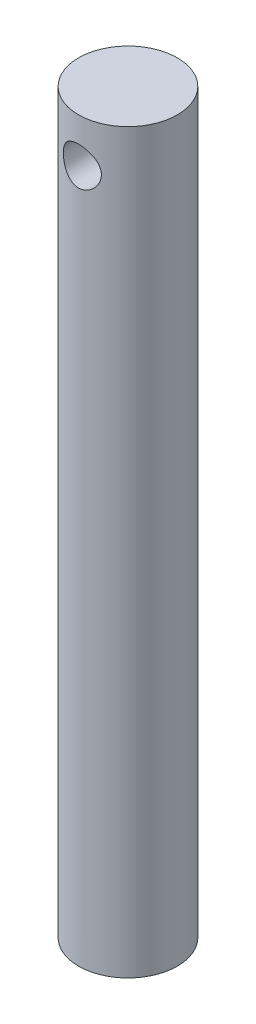
ISO-10303-21;
HEADER;
FILE_DESCRIPTION(('STEP AP214'),'2;1');
FILE_NAME('part.step','',(''),(''),'','','');
FILE_SCHEMA(('AUTOMOTIVE_DESIGN { 1 0 10303 214 1 1 1 1 }'));
ENDSEC;
DATA;
#1=APPLICATION_CONTEXT('core data for automotive mechanical design processes');
#2=APPLICATION_PROTOCOL_DEFINITION('international standard','automotive_design',2000,#1);
#3=PRODUCT_CONTEXT('',#1,'mechanical');
#4=PRODUCT('Part','Part','',(#3));
#5=PRODUCT_RELATED_PRODUCT_CATEGORY('part','',(#4));
#6=PRODUCT_DEFINITION_FORMATION('','',#4);
#7=PRODUCT_DEFINITION_CONTEXT('part definition',#1,'design');
#8=PRODUCT_DEFINITION('design','',#6,#7);
#9=PRODUCT_DEFINITION_SHAPE('','',#8);
#10=(LENGTH_UNIT() NAMED_UNIT(*) SI_UNIT(.MILLI.,.METRE.));
#11=(NAMED_UNIT(*) PLANE_ANGLE_UNIT() SI_UNIT($,.RADIAN.));
#12=(NAMED_UNIT(*) SI_UNIT($,.STERADIAN.) SOLID_ANGLE_UNIT());
#13=UNCERTAINTY_MEASURE_WITH_UNIT(LENGTH_MEASURE(1.E-05),#10,'distance_accuracy_value','');
#14=(GEOMETRIC_REPRESENTATION_CONTEXT(3) GLOBAL_UNCERTAINTY_ASSIGNED_CONTEXT((#13)) GLOBAL_UNIT_ASSIGNED_CONTEXT((#10,
#11,#12)) REPRESENTATION_CONTEXT('',''));
#15=CARTESIAN_POINT('',(0.,0.,0.));
#16=DIRECTION('',(0.,0.,1.));
#17=DIRECTION('',(1.,0.,0.));
#18=AXIS2_PLACEMENT_3D('',#15,#16,#17);
#19=CARTESIAN_POINT('',(0.,127.,0.));
#20=DIRECTION('',(0.,-1.,0.));
#21=DIRECTION('',(0.,0.,-1.));
#22=AXIS2_PLACEMENT_3D('',#19,#20,#21);
#23=CYLINDRICAL_SURFACE('',#22,9.906);
#24=CARTESIAN_POINT('',(-3.81,138.938,9.144));
#25=CARTESIAN_POINT('',(-3.81000064407979,138.835367761557,9.14399940626881));
#26=CARTESIAN_POINT('',(-3.80584949466351,138.732743870049,9.14573263028228));
#27=CARTESIAN_POINT('',(-3.78929119284377,138.528245611501,9.15260559865723));
#28=CARTESIAN_POINT('',(-3.77688145220304,138.426371489562,9.15774641095272));
#29=CARTESIAN_POINT('',(-3.74393962490596,138.22421007908,9.17126322748425));
#30=CARTESIAN_POINT('',(-3.72341135670093,138.123922067558,9.17963771075854));
#31=CARTESIAN_POINT('',(-3.67444672922316,137.925579710643,9.1993459318876));
#32=CARTESIAN_POINT('',(-3.64600722875716,137.827526269264,9.210680845086));
#33=CARTESIAN_POINT('',(-3.54937685298785,137.538293402116,9.24854539144749));
#34=CARTESIAN_POINT('',(-3.46975226991935,137.351305122067,9.27898805963824));
#35=CARTESIAN_POINT('',(-3.2825953359449,136.993377578225,9.34683127229454));
#36=CARTESIAN_POINT('',(-3.17505415950617,136.822443413082,9.38423401605287));
#37=CARTESIAN_POINT('',(-2.9290577708463,136.49238282444,9.46398061417543));
#38=CARTESIAN_POINT('',(-2.78937450425499,136.334206028794,9.50647493369805));
#39=CARTESIAN_POINT('',(-2.48566837123645,136.042855648947,9.59036424595744));
#40=CARTESIAN_POINT('',(-2.32163997465159,135.909687761297,9.63175898639211));
#41=CARTESIAN_POINT('',(-1.96661228086564,135.667475176788,9.71058508592759));
#42=CARTESIAN_POINT('',(-1.77485371515296,135.559473496429,9.74781970452447));
#43=CARTESIAN_POINT('',(-1.37420271446898,135.377661781081,9.81231290433514));
#44=CARTESIAN_POINT('',(-1.16531658852297,135.303839222045,9.83957513889883));
#45=CARTESIAN_POINT('',(-0.746345393346816,135.195844056231,9.87998335779282));
#46=CARTESIAN_POINT('',(-0.536740129616208,135.160031982889,9.89371103140016));
#47=CARTESIAN_POINT('',(-0.114075261824232,135.123811580983,9.90759658617764));
#48=CARTESIAN_POINT('',(0.0989831355955358,135.123391141241,9.90775910940382));
#49=CARTESIAN_POINT('',(0.510717937437508,135.157032339318,9.89485997669889));
#50=CARTESIAN_POINT('',(0.709566088010392,135.18930201241,9.88248555149261));
#51=CARTESIAN_POINT('',(1.09877395484567,135.284380357875,9.84681373399076));
#52=CARTESIAN_POINT('',(1.28913306588263,135.347191203893,9.82351556424673));
#53=CARTESIAN_POINT('',(1.65930924013136,135.502351858105,9.76786112314378));
#54=CARTESIAN_POINT('',(1.83892884044366,135.595124647285,9.735376027404));
#55=CARTESIAN_POINT('',(2.18050433069836,135.807193478922,9.66461111215741));
#56=CARTESIAN_POINT('',(2.34245434320434,135.926498306882,9.62632937456256));
#57=CARTESIAN_POINT('',(2.6546141636287,136.196775727086,9.54512711153657));
#58=CARTESIAN_POINT('',(2.80349766677959,136.349240202233,9.50206607612672));
#59=CARTESIAN_POINT('',(3.07409976914635,136.677198128024,9.41800771900413));
#60=CARTESIAN_POINT('',(3.19581079788691,136.85269797494,9.37701097487769));
#61=CARTESIAN_POINT('',(3.41133193648662,137.227239500013,9.30081059772249));
#62=CARTESIAN_POINT('',(3.50438873364169,137.426751143538,9.26577274018051));
#63=CARTESIAN_POINT('',(3.65507214474186,137.840318039828,9.20738248122136));
#64=CARTESIAN_POINT('',(3.71271971060063,138.054364608731,9.18402317104371));
#65=CARTESIAN_POINT('',(3.78785230231926,138.477767574732,9.15328218541058));
#66=CARTESIAN_POINT('',(3.80745520129422,138.68668648539,9.14505937476269));
#67=CARTESIAN_POINT('',(3.81207771836109,139.104944675398,9.14313523480919));
#68=CARTESIAN_POINT('',(3.79710664273498,139.314283826476,9.14942999780548));
#69=CARTESIAN_POINT('',(3.73492969483969,139.716245247047,9.1749740058038));
#70=CARTESIAN_POINT('',(3.68940556027745,139.909175747685,9.19354667342028));
#71=CARTESIAN_POINT('',(3.56955542769551,140.284557063414,9.24073740296942));
#72=CARTESIAN_POINT('',(3.49522334435248,140.467005654976,9.26935758719549));
#73=CARTESIAN_POINT('',(3.31663888856321,140.824106517288,9.33477870200858));
#74=CARTESIAN_POINT('',(3.21133968577424,140.998183599877,9.37185342294639));
#75=CARTESIAN_POINT('',(2.97490700981402,141.326945735599,9.4495624591012));
#76=CARTESIAN_POINT('',(2.8437636654063,141.481623341996,9.49019813112897));
#77=CARTESIAN_POINT('',(2.54893041522458,141.778003070045,9.57375445727994));
#78=CARTESIAN_POINT('',(2.38364407893408,141.918131286564,9.61664483286183));
#79=CARTESIAN_POINT('',(2.03085929944928,142.16887184677,9.69727511936323));
#80=CARTESIAN_POINT('',(1.84336049333767,142.279483708109,9.73501494610908));
#81=CARTESIAN_POINT('',(1.45131942169701,142.467432143206,9.80111641873104));
#82=CARTESIAN_POINT('',(1.24681828496458,142.54484637833,9.82949991606386));
#83=CARTESIAN_POINT('',(0.826347495284124,142.663710045121,9.87373148779787));
#84=CARTESIAN_POINT('',(0.610383605247227,142.705177370744,9.88958579873585));
#85=CARTESIAN_POINT('',(0.187306801994696,142.748966599566,9.90635333328099));
#86=CARTESIAN_POINT('',(-0.0195433025637882,142.753520351434,9.90811831216707));
#87=CARTESIAN_POINT('',(-0.430943143853496,142.729151849029,9.89875943186073));
#88=CARTESIAN_POINT('',(-0.635493179334599,142.700233994214,9.88763726653536));
#89=CARTESIAN_POINT('',(-1.03091524998151,142.611323247502,9.85415730172312));
#90=CARTESIAN_POINT('',(-1.22200670984564,142.552181193136,9.8321076106909));
#91=CARTESIAN_POINT('',(-1.59155178379963,142.40536444401,9.77909410209705));
#92=CARTESIAN_POINT('',(-1.77000299715905,142.31768434669,9.74812859680339));
#93=CARTESIAN_POINT('',(-2.11760943784215,142.112012506323,9.67870518515733));
#94=CARTESIAN_POINT('',(-2.28603587580459,141.992880309749,9.63998253613216));
#95=CARTESIAN_POINT('',(-2.60118581085774,141.72944025956,9.55976767633285));
#96=CARTESIAN_POINT('',(-2.74790137698855,141.585123247705,9.51827446146684));
#97=CARTESIAN_POINT('',(-3.02395872855298,141.265830579638,9.43432533411643));
#98=CARTESIAN_POINT('',(-3.15186128444348,141.08958796698,9.39194630964859));
#99=CARTESIAN_POINT('',(-3.37636605799997,140.716634384034,9.31360345072929));
#100=CARTESIAN_POINT('',(-3.47296180622188,140.519919194241,9.27764094291817));
#101=CARTESIAN_POINT('',(-3.59440689020919,140.206875300182,9.23098564767509));
#102=CARTESIAN_POINT('',(-3.63171131729941,140.095817834503,9.21632772326485));
#103=CARTESIAN_POINT('',(-3.69601474500478,139.870356985496,9.1907300197407));
#104=CARTESIAN_POINT('',(-3.72301848526011,139.755955167153,9.17978853084318));
#105=CARTESIAN_POINT('',(-3.7663630913293,139.524880622978,9.16208998800678));
#106=CARTESIAN_POINT('',(-3.78270805513767,139.408208787691,9.15533132594167));
#107=CARTESIAN_POINT('',(-3.80452532812323,139.173687514795,9.14628700667753));
#108=CARTESIAN_POINT('',(-3.8099992604932,139.055838255633,9.14400068169854));
#109=CARTESIAN_POINT('',(-3.81,138.938,9.144));
#110=B_SPLINE_CURVE_WITH_KNOTS('',3,(#24,#25,#26,#27,#28,#29,#30,#31,#32,#33,#34,#35,#36,#37,
#38,#39,#40,#41,#42,#43,#44,#45,#46,#47,#48,#49,#50,#51,#52,#53,#54,#55,#56,#57,#58,#59,#60,#61,
#62,#63,#64,#65,#66,#67,#68,#69,#70,#71,#72,#73,#74,#75,#76,#77,#78,#79,#80,#81,#82,#83,#84,#85,
#86,#87,#88,#89,#90,#91,#92,#93,#94,#95,#96,#97,#98,#99,#100,#101,#102,#103,#104,#105,#106,#107,
#108,#109),.UNSPECIFIED.,.T.,.F.,(4,2,2,2,2,2,2,2,2,2,2,2,2,2,2,2,2,2,2,2,2,2,2,2,2,2,2,2,2,2,2,
2,2,2,2,2,2,2,2,2,2,2,4),(0.,0.307783699913211,0.615663904497332,0.923399473237848,
1.23125740471694,1.84475689700249,2.4584505773025,3.1013622734596,3.74442023542112,
4.41066635064775,5.07666814378749,5.71260479854275,6.34832383199484,6.95098485615205,
7.55368877851336,8.16530319158036,8.77712042972128,9.42640472419681,10.0758696895043,
10.7411829127898,11.4061020849495,12.0328057673849,12.6593407795574,13.2539443428474,
13.8486735773152,14.4664247782322,15.084412389733,15.7439919439602,16.4035822761807,
17.0616210549078,17.719332081109,18.3369559627867,18.9544986741085,19.5555431735343,
20.1567015234402,20.7836878595226,21.4109026706713,22.0733564103163,22.735946956593,
23.0896837212891,23.4432575246973,23.7966953088245,24.1500803159167),.UNSPECIFIED.);
#111=CARTESIAN_POINT('',(-3.81,138.938,9.144));
#112=VERTEX_POINT('',#111);
#113=EDGE_CURVE('E47',#112,#112,#110,.T.);
#114=ORIENTED_EDGE('',*,*,#113,.F.);
#115=EDGE_LOOP('',(#114));
#116=FACE_BOUND('',#115,.T.);
#117=CARTESIAN_POINT('',(0.,0.,0.));
#118=DIRECTION('',(0.,1.,0.));
#119=DIRECTION('',(0.,0.,1.));
#120=AXIS2_PLACEMENT_3D('',#117,#118,#119);
#121=CIRCLE('',#120,9.906);
#122=CARTESIAN_POINT('',(0.,0.,9.906));
#123=VERTEX_POINT('',#122);
#124=EDGE_CURVE('E10',#123,#123,#121,.T.);
#125=ORIENTED_EDGE('',*,*,#124,.T.);
#126=EDGE_LOOP('',(#125));
#127=FACE_BOUND('',#126,.T.);
#128=CARTESIAN_POINT('',(0.,147.828,0.));
#129=DIRECTION('',(0.,1.,0.));
#130=DIRECTION('',(0.,0.,1.));
#131=AXIS2_PLACEMENT_3D('',#128,#129,#130);
#132=CIRCLE('',#131,9.906);
#133=CARTESIAN_POINT('',(0.,147.828,9.906));
#134=VERTEX_POINT('',#133);
#135=EDGE_CURVE('E41',#134,#134,#132,.T.);
#136=ORIENTED_EDGE('',*,*,#135,.F.);
#137=EDGE_LOOP('',(#136));
#138=FACE_BOUND('',#137,.T.);
#139=CARTESIAN_POINT('',(0.,142.748,-9.906));
#140=CARTESIAN_POINT('',(0.102951452316558,142.748000540181,-9.90600041909554));
#141=CARTESIAN_POINT('',(0.205894927827269,142.743823799372,-9.90439155058628));
#142=CARTESIAN_POINT('',(0.411041392529844,142.727160702098,-9.89800056696715));
#143=CARTESIAN_POINT('',(0.513244143076979,142.714671778305,-9.89321747145675));
#144=CARTESIAN_POINT('',(0.716065064591693,142.681514315182,-9.88060721885944));
#145=CARTESIAN_POINT('',(0.816684126193067,142.660850557545,-9.872781841336));
#146=CARTESIAN_POINT('',(1.0156970813858,142.611552563163,-9.85429911685564));
#147=CARTESIAN_POINT('',(1.11409009309105,142.582915225334,-9.84364066813414));
#148=CARTESIAN_POINT('',(1.40443710397768,142.485558200413,-9.80786432119326));
#149=CARTESIAN_POINT('',(1.59219093239979,142.405288729901,-9.77890360316625));
#150=CARTESIAN_POINT('',(1.95143768746361,142.216606040951,-9.71360881281954));
#151=CARTESIAN_POINT('',(2.12292600606045,142.108184879417,-9.6772726601279));
#152=CARTESIAN_POINT('',(2.45252198036719,141.861232768004,-9.59915498221588));
#153=CARTESIAN_POINT('',(2.6098211464377,141.72167178536,-9.55721388477039));
#154=CARTESIAN_POINT('',(2.89943346528226,141.418595841145,-9.47337879291962));
#155=CARTESIAN_POINT('',(3.03173838216358,141.255073015276,-9.43148481854643));
#156=CARTESIAN_POINT('',(3.27290116765288,140.900645483747,-9.35060484769927));
#157=CARTESIAN_POINT('',(3.38059243318892,140.708900036692,-9.31180533805852));
#158=CARTESIAN_POINT('',(3.56183491545811,140.308294409781,-9.24400363096624));
#159=CARTESIAN_POINT('',(3.63540057600028,140.099441514846,-9.2149972899315));
#160=CARTESIAN_POINT('',(3.74306987828454,139.679888184203,-9.1717784194632));
#161=CARTESIAN_POINT('',(3.77872447737679,139.469647473881,-9.15698705872038));
#162=CARTESIAN_POINT('',(3.81440741292258,139.045686660274,-9.14218483682008));
#163=CARTESIAN_POINT('',(3.81445146171521,138.831968133123,-9.14216745698198));
#164=CARTESIAN_POINT('',(3.78009387905088,138.421570871199,-9.15641812435042));
#165=CARTESIAN_POINT('',(3.747878645666,138.224671663566,-9.16977941769957));
#166=CARTESIAN_POINT('',(3.65354320626027,137.839325418683,-9.20776934597109));
#167=CARTESIAN_POINT('',(3.59141825413749,137.650879728035,-9.23239976905859));
#168=CARTESIAN_POINT('',(3.4378797979702,137.283456732933,-9.29067540177976));
#169=CARTESIAN_POINT('',(3.34591838520649,137.104735972045,-9.32448715543932));
#170=CARTESIAN_POINT('',(3.13570028088474,136.76464207314,-9.39726392320105));
#171=CARTESIAN_POINT('',(3.01743418717182,136.60327516863,-9.43623077788224));
#172=CARTESIAN_POINT('',(2.74808465365681,136.290417038269,-9.51829966058227));
#173=CARTESIAN_POINT('',(2.59526752140433,136.140440109316,-9.56149886792701));
#174=CARTESIAN_POINT('',(2.26616725905917,135.86777906001,-9.64479686721688));
#175=CARTESIAN_POINT('',(2.08988014641493,135.745099581139,-9.6848951311425));
#176=CARTESIAN_POINT('',(1.71481867990617,135.528728106521,-9.75834583860276));
#177=CARTESIAN_POINT('',(1.51571263911431,135.435565057828,-9.79157184226019));
#178=CARTESIAN_POINT('',(1.10305545161451,135.284566459715,-9.84658992988401));
#179=CARTESIAN_POINT('',(0.889511120082673,135.226714370317,-9.86838736642081));
#180=CARTESIAN_POINT('',(0.466764432040498,135.150948114994,-9.8971382924258));
#181=CARTESIAN_POINT('',(0.257978418134734,135.130996368467,-9.90484819201818));
#182=CARTESIAN_POINT('',(-0.160077997450235,135.125632560432,-9.90690992089128));
#183=CARTESIAN_POINT('',(-0.369348273419032,135.140212362511,-9.90126489689365));
#184=CARTESIAN_POINT('',(-0.773465648622239,135.201967468535,-9.87774889043116));
#185=CARTESIAN_POINT('',(-0.96855271663508,135.247786866392,-9.86038677719541));
#186=CARTESIAN_POINT('',(-1.34811685532844,135.368912747283,-9.81569987909822));
#187=CARTESIAN_POINT('',(-1.53259254644601,135.444223054476,-9.78837380221666));
#188=CARTESIAN_POINT('',(-1.89188998396082,135.624622245618,-9.72542372218223));
#189=CARTESIAN_POINT('',(-2.06625793143414,135.730534453119,-9.68957596903461));
#190=CARTESIAN_POINT('',(-2.39534274723316,135.968207303259,-9.61351869012882));
#191=CARTESIAN_POINT('',(-2.55005206901514,136.099977823282,-9.57330750025266));
#192=CARTESIAN_POINT('',(-2.84532120305099,136.395083700072,-9.4898867707156));
#193=CARTESIAN_POINT('',(-2.98444005430399,136.559855209505,-9.44664408288323));
#194=CARTESIAN_POINT('',(-3.23336382696211,136.91122539351,-9.36437021488224));
#195=CARTESIAN_POINT('',(-3.34316534557832,137.097826598188,-9.32533952390247));
#196=CARTESIAN_POINT('',(-3.53065332722863,137.48955389667,-9.25599417091881));
#197=CARTESIAN_POINT('',(-3.60813972083793,137.694786088629,-9.2257341515192));
#198=CARTESIAN_POINT('',(-3.72690943213324,138.116884961153,-9.17840662755323));
#199=CARTESIAN_POINT('',(-3.76821675358831,138.33374382623,-9.16133037683006));
#200=CARTESIAN_POINT('',(-3.81125287715294,138.757236233413,-9.14350474253482));
#201=CARTESIAN_POINT('',(-3.81545531414887,138.963577341633,-9.1417351027162));
#202=CARTESIAN_POINT('',(-3.79056009296788,139.373865644301,-9.1520855377943));
#203=CARTESIAN_POINT('',(-3.76146594749028,139.577813088981,-9.16420414751848));
#204=CARTESIAN_POINT('',(-3.67276573608082,139.970504073708,-9.20009681907282));
#205=CARTESIAN_POINT('',(-3.61422380168038,140.159528490105,-9.22346323919623));
#206=CARTESIAN_POINT('',(-3.46925113825939,140.52516921338,-9.27896164988509));
#207=CARTESIAN_POINT('',(-3.38281319316615,140.701782295311,-9.31109590816096));
#208=CARTESIAN_POINT('',(-3.17905149397248,141.048032871229,-9.38268122968774));
#209=CARTESIAN_POINT('',(-3.06030482757507,141.216770028255,-9.4224349679241));
#210=CARTESIAN_POINT('',(-2.79748655958821,141.532696920512,-9.50378029216077));
#211=CARTESIAN_POINT('',(-2.65340670062997,141.67987960129,-9.5453724740836));
#212=CARTESIAN_POINT('',(-2.33387964048641,141.957327453219,-9.62863052795752));
#213=CARTESIAN_POINT('',(-2.15709627964755,142.086112712463,-9.6701602580737));
#214=CARTESIAN_POINT('',(-1.87669766081551,142.255543316826,-9.72707642139736));
#215=CARTESIAN_POINT('',(-1.78062474766151,142.30808951834,-9.74516237578806));
#216=CARTESIAN_POINT('',(-1.58399814617687,142.404847866079,-9.77904456847397));
#217=CARTESIAN_POINT('',(-1.48344635427935,142.449063498904,-9.79484176404302));
#218=CARTESIAN_POINT('',(-1.27179056260768,142.53138036069,-9.82463988840783));
#219=CARTESIAN_POINT('',(-1.1604280314039,142.568885828463,-9.83845357857587));
#220=CARTESIAN_POINT('',(-0.934399923631145,142.633511365517,-9.86248649658498));
#221=CARTESIAN_POINT('',(-0.819735845453673,142.660636068602,-9.87270732805266));
#222=CARTESIAN_POINT('',(-0.588136616839306,142.704175261241,-9.88920652580209));
#223=CARTESIAN_POINT('',(-0.471201974748701,142.720592120294,-9.89548576429246));
#224=CARTESIAN_POINT('',(-0.236174611331922,142.742503395554,-9.90388196215616));
#225=CARTESIAN_POINT('',(-0.118082058776632,142.74799938043,-9.90599951931067));
#226=CARTESIAN_POINT('',(0.,142.748,-9.906));
#227=B_SPLINE_CURVE_WITH_KNOTS('',3,(#139,#140,#141,#142,#143,#144,#145,#146,#147,#148,#149,
#150,#151,#152,#153,#154,#155,#156,#157,#158,#159,#160,#161,#162,#163,#164,#165,#166,#167,#168,
#169,#170,#171,#172,#173,#174,#175,#176,#177,#178,#179,#180,#181,#182,#183,#184,#185,#186,#187,
#188,#189,#190,#191,#192,#193,#194,#195,#196,#197,#198,#199,#200,#201,#202,#203,#204,#205,#206,
#207,#208,#209,#210,#211,#212,#213,#214,#215,#216,#217,#218,#219,#220,#221,#222,#223,#224,#225,
#226),.UNSPECIFIED.,.T.,.F.,(4,2,2,2,2,2,2,2,2,2,2,2,2,2,2,2,2,2,2,2,2,2,2,2,2,2,2,2,2,2,2,2,2,
2,2,2,2,2,2,2,2,2,2,4),(0.,0.308743121646664,0.617581646956943,0.926239790295092,
1.23501814502226,1.85067362481603,2.46650300306477,3.10694013952496,3.74758794070077,
4.4141816867313,5.08049303608294,5.71835167222403,6.35592886770874,6.95303333309825,
7.55023257882259,8.15908621225651,8.76815782065826,9.42046744169143,10.0728878926298,
10.7364133708131,11.3996278085575,12.0260491849151,12.6523229769474,13.2530125542254,
13.8537800502115,14.4725169663047,15.0914906898383,15.7482624243636,16.4051103556242,
17.0659666667115,17.7263841858652,18.342412027798,18.9583748864514,19.5535259705033,
20.1488311303645,20.7764800339403,21.4043339005841,22.068669274544,22.4012827158096,
22.7337566373318,23.0881629096421,23.4424107957836,23.79658026513,24.1506988580864),.UNSPECIFIED.);
#228=CARTESIAN_POINT('',(0.,142.748,-9.906));
#229=VERTEX_POINT('',#228);
#230=EDGE_CURVE('E34',#229,#229,#227,.T.);
#231=ORIENTED_EDGE('',*,*,#230,.F.);
#232=EDGE_LOOP('',(#231));
#233=FACE_BOUND('',#232,.T.);
#234=ADVANCED_FACE('F30',(#116,#127,#138,#233),#23,.T.);
#235=CARTESIAN_POINT('',(0.,0.,0.));
#236=DIRECTION('',(0.,1.,0.));
#237=DIRECTION('',(0.,0.,1.));
#238=AXIS2_PLACEMENT_3D('',#235,#236,#237);
#239=PLANE('',#238);
#240=ORIENTED_EDGE('',*,*,#124,.F.);
#241=EDGE_LOOP('',(#240));
#242=FACE_BOUND('',#241,.T.);
#243=ADVANCED_FACE('F59',(#242),#239,.F.);
#244=CARTESIAN_POINT('',(0.,147.828,0.));
#245=DIRECTION('',(0.,1.,0.));
#246=DIRECTION('',(0.,0.,1.));
#247=AXIS2_PLACEMENT_3D('',#244,#245,#246);
#248=PLANE('',#247);
#249=ORIENTED_EDGE('',*,*,#135,.T.);
#250=EDGE_LOOP('',(#249));
#251=FACE_BOUND('',#250,.T.);
#252=ADVANCED_FACE('F55',(#251),#248,.T.);
#253=CARTESIAN_POINT('',(0.,138.938,15.748));
#254=DIRECTION('',(0.,0.,-1.));
#255=DIRECTION('',(-1.,0.,0.));
#256=AXIS2_PLACEMENT_3D('',#253,#254,#255);
#257=CYLINDRICAL_SURFACE('',#256,3.81);
#258=ORIENTED_EDGE('',*,*,#113,.T.);
#259=EDGE_LOOP('',(#258));
#260=FACE_BOUND('',#259,.T.);
#261=ORIENTED_EDGE('',*,*,#230,.T.);
#262=EDGE_LOOP('',(#261));
#263=FACE_BOUND('',#262,.T.);
#264=ADVANCED_FACE('F51',(#260,#263),#257,.F.);
#265=CLOSED_SHELL('',(#234,#243,#252,#264));
#266=MANIFOLD_SOLID_BREP('B2',#265);
#267=ADVANCED_BREP_SHAPE_REPRESENTATION('',(#18,#266),#14);
#268=SHAPE_DEFINITION_REPRESENTATION(#9,#267);
ENDSEC;
END-ISO-10303-21;
